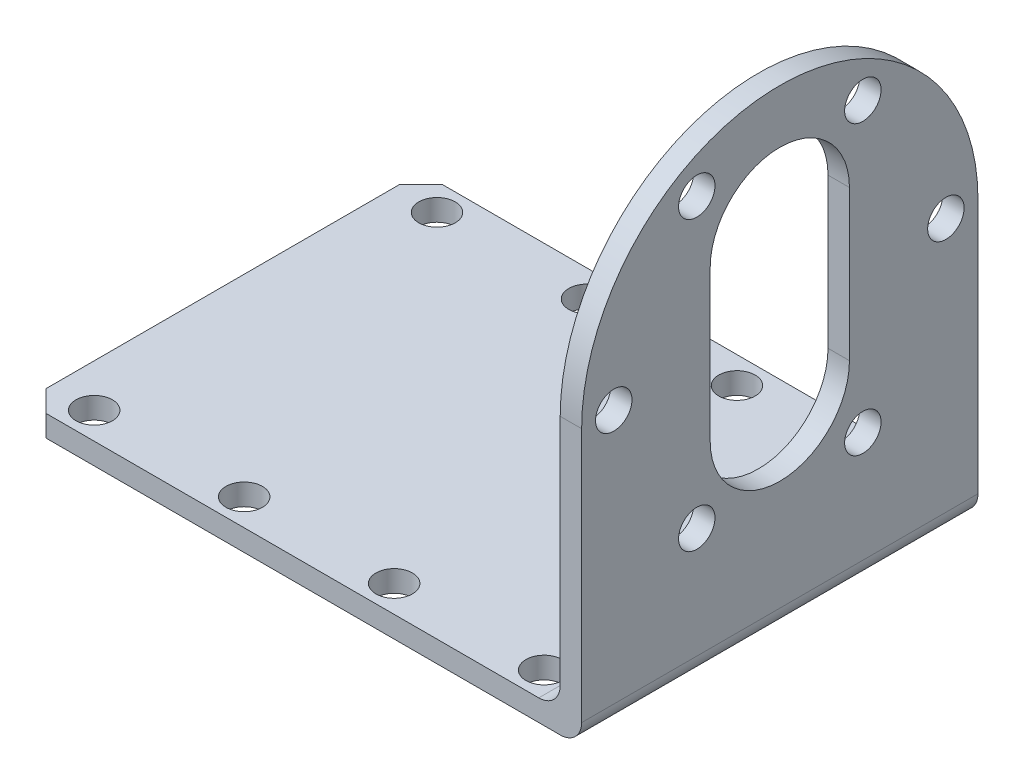
ISO-10303-21;
HEADER;
FILE_DESCRIPTION(('STEP AP214'),'2;1');
FILE_NAME('part.step','',(''),(''),'','','');
FILE_SCHEMA(('AUTOMOTIVE_DESIGN { 1 0 10303 214 1 1 1 1 }'));
ENDSEC;
DATA;
#1=APPLICATION_CONTEXT('core data for automotive mechanical design processes');
#2=APPLICATION_PROTOCOL_DEFINITION('international standard','automotive_design',2000,#1);
#3=PRODUCT_CONTEXT('',#1,'mechanical');
#4=PRODUCT('Part','Part','',(#3));
#5=PRODUCT_RELATED_PRODUCT_CATEGORY('part','',(#4));
#6=PRODUCT_DEFINITION_FORMATION('','',#4);
#7=PRODUCT_DEFINITION_CONTEXT('part definition',#1,'design');
#8=PRODUCT_DEFINITION('design','',#6,#7);
#9=PRODUCT_DEFINITION_SHAPE('','',#8);
#10=(LENGTH_UNIT() NAMED_UNIT(*) SI_UNIT(.MILLI.,.METRE.));
#11=(NAMED_UNIT(*) PLANE_ANGLE_UNIT() SI_UNIT($,.RADIAN.));
#12=(NAMED_UNIT(*) SI_UNIT($,.STERADIAN.) SOLID_ANGLE_UNIT());
#13=UNCERTAINTY_MEASURE_WITH_UNIT(LENGTH_MEASURE(1.E-05),#10,'distance_accuracy_value','');
#14=(GEOMETRIC_REPRESENTATION_CONTEXT(3) GLOBAL_UNCERTAINTY_ASSIGNED_CONTEXT((#13)) GLOBAL_UNIT_ASSIGNED_CONTEXT((#10,
#11,#12)) REPRESENTATION_CONTEXT('',''));
#15=CARTESIAN_POINT('',(0.,0.,0.));
#16=DIRECTION('',(0.,0.,1.));
#17=DIRECTION('',(1.,0.,0.));
#18=AXIS2_PLACEMENT_3D('',#15,#16,#17);
#19=CARTESIAN_POINT('',(26.,25.76,0.));
#20=DIRECTION('',(1.,0.,0.));
#21=DIRECTION('',(0.,0.,-1.));
#22=AXIS2_PLACEMENT_3D('',#19,#20,#21);
#23=CYLINDRICAL_SURFACE('',#22,18.5);
#24=DIRECTION('',(1.,0.,0.));
#25=VECTOR('',#24,1.);
#26=CARTESIAN_POINT('',(-26.,25.76,18.5));
#27=LINE('',#26,#25);
#28=CARTESIAN_POINT('',(26.,25.76,18.5));
#29=VERTEX_POINT('',#28);
#30=CARTESIAN_POINT('',(24.,25.76,18.5));
#31=VERTEX_POINT('',#30);
#32=EDGE_CURVE('E311',#29,#31,#27,.F.);
#33=ORIENTED_EDGE('',*,*,#32,.F.);
#34=CARTESIAN_POINT('',(26.,25.76,0.));
#35=DIRECTION('',(-1.,0.,0.));
#36=DIRECTION('',(0.,0.,1.));
#37=AXIS2_PLACEMENT_3D('',#34,#35,#36);
#38=CIRCLE('',#37,18.5);
#39=CARTESIAN_POINT('',(26.,25.76,-18.5));
#40=VERTEX_POINT('',#39);
#41=EDGE_CURVE('E317',#40,#29,#38,.F.);
#42=ORIENTED_EDGE('',*,*,#41,.F.);
#43=DIRECTION('',(1.,0.,0.));
#44=VECTOR('',#43,1.);
#45=CARTESIAN_POINT('',(-26.,25.76,-18.5));
#46=LINE('',#45,#44);
#47=CARTESIAN_POINT('',(24.,25.76,-18.5));
#48=VERTEX_POINT('',#47);
#49=EDGE_CURVE('E314',#48,#40,#46,.T.);
#50=ORIENTED_EDGE('',*,*,#49,.F.);
#51=CARTESIAN_POINT('',(24.,25.76,0.));
#52=DIRECTION('',(1.,0.,0.));
#53=DIRECTION('',(0.,0.,-1.));
#54=AXIS2_PLACEMENT_3D('',#51,#52,#53);
#55=CIRCLE('',#54,18.5);
#56=EDGE_CURVE('E319',#31,#48,#55,.F.);
#57=ORIENTED_EDGE('',*,*,#56,.F.);
#58=EDGE_LOOP('',(#33,#42,#50,#57));
#59=FACE_BOUND('',#58,.T.);
#60=ADVANCED_FACE('F38',(#59),#23,.T.);
#61=CARTESIAN_POINT('',(26.,2.,-18.5));
#62=DIRECTION('',(-1.,0.,0.));
#63=DIRECTION('',(0.,0.,1.));
#64=AXIS2_PLACEMENT_3D('',#61,#62,#63);
#65=PLANE('',#64);
#66=DIRECTION('',(0.,-1.,0.));
#67=VECTOR('',#66,1.);
#68=CARTESIAN_POINT('',(26.,18.76,-6.50000000000001));
#69=LINE('',#68,#67);
#70=CARTESIAN_POINT('',(26.,32.76,-6.50000000000001));
#71=VERTEX_POINT('',#70);
#72=CARTESIAN_POINT('',(26.,18.76,-6.50000000000001));
#73=VERTEX_POINT('',#72);
#74=EDGE_CURVE('E150',#71,#73,#69,.T.);
#75=ORIENTED_EDGE('',*,*,#74,.T.);
#76=CARTESIAN_POINT('',(26.,18.76,0.));
#77=DIRECTION('',(-1.,0.,0.));
#78=DIRECTION('',(0.,0.,1.));
#79=AXIS2_PLACEMENT_3D('',#76,#77,#78);
#80=CIRCLE('',#79,6.5);
#81=CARTESIAN_POINT('',(26.,18.76,6.5));
#82=VERTEX_POINT('',#81);
#83=EDGE_CURVE('E142',#73,#82,#80,.T.);
#84=ORIENTED_EDGE('',*,*,#83,.T.);
#85=DIRECTION('',(0.,1.,0.));
#86=VECTOR('',#85,1.);
#87=CARTESIAN_POINT('',(26.,18.76,6.5));
#88=LINE('',#87,#86);
#89=CARTESIAN_POINT('',(26.,32.76,6.5));
#90=VERTEX_POINT('',#89);
#91=EDGE_CURVE('E154',#82,#90,#88,.T.);
#92=ORIENTED_EDGE('',*,*,#91,.T.);
#93=CARTESIAN_POINT('',(26.,32.76,0.));
#94=DIRECTION('',(-1.,0.,0.));
#95=DIRECTION('',(0.,0.,1.));
#96=AXIS2_PLACEMENT_3D('',#93,#94,#95);
#97=CIRCLE('',#96,6.5);
#98=EDGE_CURVE('E158',#90,#71,#97,.T.);
#99=ORIENTED_EDGE('',*,*,#98,.T.);
#100=EDGE_LOOP('',(#75,#84,#92,#99));
#101=FACE_BOUND('',#100,.T.);
#102=CARTESIAN_POINT('',(26.,25.76,-15.5));
#103=DIRECTION('',(-1.,0.,0.));
#104=DIRECTION('',(0.,0.,1.));
#105=AXIS2_PLACEMENT_3D('',#102,#103,#104);
#106=CIRCLE('',#105,1.7);
#107=CARTESIAN_POINT('',(26.,25.76,-13.8));
#108=VERTEX_POINT('',#107);
#109=EDGE_CURVE('E184',#108,#108,#106,.T.);
#110=ORIENTED_EDGE('',*,*,#109,.T.);
#111=EDGE_LOOP('',(#110));
#112=FACE_BOUND('',#111,.T.);
#113=CARTESIAN_POINT('',(26.,39.1833937586588,-7.74999999999997));
#114=DIRECTION('',(-1.,0.,0.));
#115=DIRECTION('',(0.,0.,1.));
#116=AXIS2_PLACEMENT_3D('',#113,#114,#115);
#117=CIRCLE('',#116,1.7);
#118=CARTESIAN_POINT('',(26.,39.1833937586588,-6.04999999999997));
#119=VERTEX_POINT('',#118);
#120=EDGE_CURVE('E190',#119,#119,#117,.T.);
#121=ORIENTED_EDGE('',*,*,#120,.T.);
#122=EDGE_LOOP('',(#121));
#123=FACE_BOUND('',#122,.T.);
#124=CARTESIAN_POINT('',(26.,39.1833937586588,7.75000000000006));
#125=DIRECTION('',(-1.,0.,0.));
#126=DIRECTION('',(0.,0.,1.));
#127=AXIS2_PLACEMENT_3D('',#124,#125,#126);
#128=CIRCLE('',#127,1.7);
#129=CARTESIAN_POINT('',(26.,39.1833937586588,9.45000000000006));
#130=VERTEX_POINT('',#129);
#131=EDGE_CURVE('E196',#130,#130,#128,.T.);
#132=ORIENTED_EDGE('',*,*,#131,.T.);
#133=EDGE_LOOP('',(#132));
#134=FACE_BOUND('',#133,.T.);
#135=CARTESIAN_POINT('',(26.,25.7599999999999,15.5));
#136=DIRECTION('',(-1.,0.,0.));
#137=DIRECTION('',(0.,0.,1.));
#138=AXIS2_PLACEMENT_3D('',#135,#136,#137);
#139=CIRCLE('',#138,1.7);
#140=CARTESIAN_POINT('',(26.,25.7599999999999,17.2));
#141=VERTEX_POINT('',#140);
#142=EDGE_CURVE('E202',#141,#141,#139,.T.);
#143=ORIENTED_EDGE('',*,*,#142,.T.);
#144=EDGE_LOOP('',(#143));
#145=FACE_BOUND('',#144,.T.);
#146=CARTESIAN_POINT('',(26.,12.3366062413411,7.74999999999987));
#147=DIRECTION('',(-1.,0.,0.));
#148=DIRECTION('',(0.,0.,1.));
#149=AXIS2_PLACEMENT_3D('',#146,#147,#148);
#150=CIRCLE('',#149,1.7);
#151=CARTESIAN_POINT('',(26.,12.3366062413411,9.44999999999987));
#152=VERTEX_POINT('',#151);
#153=EDGE_CURVE('E208',#152,#152,#150,.T.);
#154=ORIENTED_EDGE('',*,*,#153,.T.);
#155=EDGE_LOOP('',(#154));
#156=FACE_BOUND('',#155,.T.);
#157=CARTESIAN_POINT('',(26.,12.3366062413413,-7.75000000000016));
#158=DIRECTION('',(-1.,0.,0.));
#159=DIRECTION('',(0.,0.,1.));
#160=AXIS2_PLACEMENT_3D('',#157,#158,#159);
#161=CIRCLE('',#160,1.7);
#162=CARTESIAN_POINT('',(26.,12.3366062413413,-6.05000000000016));
#163=VERTEX_POINT('',#162);
#164=EDGE_CURVE('E214',#163,#163,#161,.T.);
#165=ORIENTED_EDGE('',*,*,#164,.T.);
#166=EDGE_LOOP('',(#165));
#167=FACE_BOUND('',#166,.T.);
#168=DIRECTION('',(0.,-1.,0.));
#169=VECTOR('',#168,1.);
#170=CARTESIAN_POINT('',(26.,2.,18.5));
#171=LINE('',#170,#169);
#172=CARTESIAN_POINT('',(26.,2.,18.5));
#173=VERTEX_POINT('',#172);
#174=EDGE_CURVE('E279',#29,#173,#171,.T.);
#175=ORIENTED_EDGE('',*,*,#174,.T.);
#176=DIRECTION('',(0.,0.,-1.));
#177=VECTOR('',#176,1.);
#178=CARTESIAN_POINT('',(26.,2.,-18.5));
#179=LINE('',#178,#177);
#180=CARTESIAN_POINT('',(26.,2.,-18.5));
#181=VERTEX_POINT('',#180);
#182=EDGE_CURVE('E321',#173,#181,#179,.T.);
#183=ORIENTED_EDGE('',*,*,#182,.T.);
#184=DIRECTION('',(0.,-1.,0.));
#185=VECTOR('',#184,1.);
#186=CARTESIAN_POINT('',(26.,2.,-18.5));
#187=LINE('',#186,#185);
#188=EDGE_CURVE('E288',#40,#181,#187,.T.);
#189=ORIENTED_EDGE('',*,*,#188,.F.);
#190=ORIENTED_EDGE('',*,*,#41,.T.);
#191=EDGE_LOOP('',(#175,#183,#189,#190));
#192=FACE_BOUND('',#191,.T.);
#193=ADVANCED_FACE('F160',(#101,#112,#123,#134,#145,#156,#167,#192),#65,.F.);
#194=CARTESIAN_POINT('',(-26.,2.,-18.5));
#195=DIRECTION('',(0.,0.,1.));
#196=DIRECTION('',(1.,0.,0.));
#197=AXIS2_PLACEMENT_3D('',#194,#195,#196);
#198=PLANE('',#197);
#199=ORIENTED_EDGE('',*,*,#188,.T.);
#200=CARTESIAN_POINT('',(24.,2.,-18.5));
#201=DIRECTION('',(0.,0.,1.));
#202=DIRECTION('',(1.,0.,0.));
#203=AXIS2_PLACEMENT_3D('',#200,#201,#202);
#204=CIRCLE('',#203,2.);
#205=CARTESIAN_POINT('',(24.,0.,-18.5));
#206=VERTEX_POINT('',#205);
#207=EDGE_CURVE('E324',#181,#206,#204,.F.);
#208=ORIENTED_EDGE('',*,*,#207,.T.);
#209=DIRECTION('',(-1.,0.,0.));
#210=VECTOR('',#209,1.);
#211=CARTESIAN_POINT('',(-26.,0.,-18.5));
#212=LINE('',#211,#210);
#213=CARTESIAN_POINT('',(-24.,0.,-18.5));
#214=VERTEX_POINT('',#213);
#215=EDGE_CURVE('E270',#206,#214,#212,.T.);
#216=ORIENTED_EDGE('',*,*,#215,.T.);
#217=DIRECTION('',(0.,1.,0.));
#218=VECTOR('',#217,1.);
#219=CARTESIAN_POINT('',(-24.,2.,-18.5));
#220=LINE('',#219,#218);
#221=CARTESIAN_POINT('',(-24.,2.,-18.5));
#222=VERTEX_POINT('',#221);
#223=EDGE_CURVE('E308',#214,#222,#220,.T.);
#224=ORIENTED_EDGE('',*,*,#223,.T.);
#225=DIRECTION('',(-1.,0.,0.));
#226=VECTOR('',#225,1.);
#227=CARTESIAN_POINT('',(-26.,2.,-18.5));
#228=LINE('',#227,#226);
#229=CARTESIAN_POINT('',(22.,2.,-18.5));
#230=VERTEX_POINT('',#229);
#231=EDGE_CURVE('E271',#230,#222,#228,.T.);
#232=ORIENTED_EDGE('',*,*,#231,.F.);
#233=CARTESIAN_POINT('',(22.,4.,-18.5));
#234=DIRECTION('',(0.,0.,1.));
#235=DIRECTION('',(1.,0.,0.));
#236=AXIS2_PLACEMENT_3D('',#233,#234,#235);
#237=CIRCLE('',#236,2.);
#238=CARTESIAN_POINT('',(24.,4.,-18.5));
#239=VERTEX_POINT('',#238);
#240=EDGE_CURVE('E11',#230,#239,#237,.T.);
#241=ORIENTED_EDGE('',*,*,#240,.T.);
#242=DIRECTION('',(0.,-1.,0.));
#243=VECTOR('',#242,1.);
#244=CARTESIAN_POINT('',(24.,44.26,-18.5));
#245=LINE('',#244,#243);
#246=EDGE_CURVE('E219',#48,#239,#245,.T.);
#247=ORIENTED_EDGE('',*,*,#246,.F.);
#248=ORIENTED_EDGE('',*,*,#49,.T.);
#249=EDGE_LOOP('',(#199,#208,#216,#224,#232,#241,#247,#248));
#250=FACE_BOUND('',#249,.T.);
#251=ADVANCED_FACE('F347',(#250),#198,.F.);
#252=CARTESIAN_POINT('',(-26.,2.,-18.5));
#253=DIRECTION('',(1.,0.,0.));
#254=DIRECTION('',(0.,0.,-1.));
#255=AXIS2_PLACEMENT_3D('',#252,#253,#254);
#256=PLANE('',#255);
#257=DIRECTION('',(0.,0.,1.));
#258=VECTOR('',#257,1.);
#259=CARTESIAN_POINT('',(-26.,0.,-18.5));
#260=LINE('',#259,#258);
#261=CARTESIAN_POINT('',(-26.,0.,-16.5));
#262=VERTEX_POINT('',#261);
#263=CARTESIAN_POINT('',(-26.,0.,16.5));
#264=VERTEX_POINT('',#263);
#265=EDGE_CURVE('E281',#262,#264,#260,.T.);
#266=ORIENTED_EDGE('',*,*,#265,.T.);
#267=DIRECTION('',(0.,1.,0.));
#268=VECTOR('',#267,1.);
#269=CARTESIAN_POINT('',(-26.,2.,16.5));
#270=LINE('',#269,#268);
#271=CARTESIAN_POINT('',(-26.,2.,16.5));
#272=VERTEX_POINT('',#271);
#273=EDGE_CURVE('E302',#264,#272,#270,.T.);
#274=ORIENTED_EDGE('',*,*,#273,.T.);
#275=DIRECTION('',(0.,0.,1.));
#276=VECTOR('',#275,1.);
#277=CARTESIAN_POINT('',(-26.,2.,-18.5));
#278=LINE('',#277,#276);
#279=CARTESIAN_POINT('',(-26.,2.,-16.5));
#280=VERTEX_POINT('',#279);
#281=EDGE_CURVE('E273',#280,#272,#278,.T.);
#282=ORIENTED_EDGE('',*,*,#281,.F.);
#283=DIRECTION('',(0.,-1.,0.));
#284=VECTOR('',#283,1.);
#285=CARTESIAN_POINT('',(-26.,2.,-16.5));
#286=LINE('',#285,#284);
#287=EDGE_CURVE('E299',#280,#262,#286,.T.);
#288=ORIENTED_EDGE('',*,*,#287,.T.);
#289=EDGE_LOOP('',(#266,#274,#282,#288));
#290=FACE_BOUND('',#289,.T.);
#291=ADVANCED_FACE('F381',(#290),#256,.F.);
#292=CARTESIAN_POINT('',(-26.,2.,18.5));
#293=DIRECTION('',(0.,0.,-1.));
#294=DIRECTION('',(-1.,0.,0.));
#295=AXIS2_PLACEMENT_3D('',#292,#293,#294);
#296=PLANE('',#295);
#297=DIRECTION('',(1.,0.,0.));
#298=VECTOR('',#297,1.);
#299=CARTESIAN_POINT('',(-26.,0.,18.5));
#300=LINE('',#299,#298);
#301=CARTESIAN_POINT('',(-24.,0.,18.5));
#302=VERTEX_POINT('',#301);
#303=CARTESIAN_POINT('',(24.,0.,18.5));
#304=VERTEX_POINT('',#303);
#305=EDGE_CURVE('E274',#302,#304,#300,.T.);
#306=ORIENTED_EDGE('',*,*,#305,.T.);
#307=CARTESIAN_POINT('',(24.,2.,18.5));
#308=DIRECTION('',(0.,0.,-1.));
#309=DIRECTION('',(-1.,0.,0.));
#310=AXIS2_PLACEMENT_3D('',#307,#308,#309);
#311=CIRCLE('',#310,2.);
#312=EDGE_CURVE('E328',#304,#173,#311,.F.);
#313=ORIENTED_EDGE('',*,*,#312,.T.);
#314=ORIENTED_EDGE('',*,*,#174,.F.);
#315=ORIENTED_EDGE('',*,*,#32,.T.);
#316=DIRECTION('',(0.,-1.,0.));
#317=VECTOR('',#316,1.);
#318=CARTESIAN_POINT('',(24.,44.26,18.5));
#319=LINE('',#318,#317);
#320=CARTESIAN_POINT('',(24.,4.,18.5));
#321=VERTEX_POINT('',#320);
#322=EDGE_CURVE('E217',#31,#321,#319,.T.);
#323=ORIENTED_EDGE('',*,*,#322,.T.);
#324=CARTESIAN_POINT('',(22.,4.,18.5));
#325=DIRECTION('',(0.,0.,-1.));
#326=DIRECTION('',(-1.,0.,0.));
#327=AXIS2_PLACEMENT_3D('',#324,#325,#326);
#328=CIRCLE('',#327,2.);
#329=CARTESIAN_POINT('',(22.,2.,18.5));
#330=VERTEX_POINT('',#329);
#331=EDGE_CURVE('E46',#321,#330,#328,.T.);
#332=ORIENTED_EDGE('',*,*,#331,.T.);
#333=DIRECTION('',(1.,0.,0.));
#334=VECTOR('',#333,1.);
#335=CARTESIAN_POINT('',(-26.,2.,18.5));
#336=LINE('',#335,#334);
#337=CARTESIAN_POINT('',(-24.,2.,18.5));
#338=VERTEX_POINT('',#337);
#339=EDGE_CURVE('E277',#338,#330,#336,.T.);
#340=ORIENTED_EDGE('',*,*,#339,.F.);
#341=DIRECTION('',(0.,-1.,0.));
#342=VECTOR('',#341,1.);
#343=CARTESIAN_POINT('',(-24.,2.,18.5));
#344=LINE('',#343,#342);
#345=EDGE_CURVE('E291',#338,#302,#344,.T.);
#346=ORIENTED_EDGE('',*,*,#345,.T.);
#347=EDGE_LOOP('',(#306,#313,#314,#315,#323,#332,#340,#346));
#348=FACE_BOUND('',#347,.T.);
#349=ADVANCED_FACE('F340',(#348),#296,.F.);
#350=CARTESIAN_POINT('',(0.,2.,0.));
#351=DIRECTION('',(0.,1.,0.));
#352=DIRECTION('',(0.,0.,1.));
#353=AXIS2_PLACEMENT_3D('',#350,#351,#352);
#354=PLANE('',#353);
#355=ORIENTED_EDGE('',*,*,#339,.T.);
#356=DIRECTION('',(0.,0.,1.));
#357=VECTOR('',#356,1.);
#358=CARTESIAN_POINT('',(22.,2.,0.));
#359=LINE('',#358,#357);
#360=EDGE_CURVE('E53',#330,#230,#359,.F.);
#361=ORIENTED_EDGE('',*,*,#360,.T.);
#362=ORIENTED_EDGE('',*,*,#231,.T.);
#363=DIRECTION('',(0.70710678118655,0.,-0.707106781186545));
#364=VECTOR('',#363,1.);
#365=CARTESIAN_POINT('',(-21.2499999999999,2.,-21.2500000000001));
#366=LINE('',#365,#364);
#367=EDGE_CURVE('E304',#222,#280,#366,.F.);
#368=ORIENTED_EDGE('',*,*,#367,.T.);
#369=ORIENTED_EDGE('',*,*,#281,.T.);
#370=DIRECTION('',(-0.707106781186545,0.,-0.70710678118655));
#371=VECTOR('',#370,1.);
#372=CARTESIAN_POINT('',(-21.2500000000001,2.,21.2499999999999));
#373=LINE('',#372,#371);
#374=EDGE_CURVE('E306',#272,#338,#373,.F.);
#375=ORIENTED_EDGE('',*,*,#374,.T.);
#376=EDGE_LOOP('',(#355,#361,#362,#368,#369,#375));
#377=FACE_BOUND('',#376,.T.);
#378=CARTESIAN_POINT('',(-22.,2.,-16.));
#379=DIRECTION('',(0.,1.,0.));
#380=DIRECTION('',(0.,0.,1.));
#381=AXIS2_PLACEMENT_3D('',#378,#379,#380);
#382=CIRCLE('',#381,1.69999999999999);
#383=CARTESIAN_POINT('',(-22.,2.,-14.3));
#384=VERTEX_POINT('',#383);
#385=EDGE_CURVE('E222',#384,#384,#382,.T.);
#386=ORIENTED_EDGE('',*,*,#385,.F.);
#387=EDGE_LOOP('',(#386));
#388=FACE_BOUND('',#387,.T.);
#389=CARTESIAN_POINT('',(-8.00000000000002,2.,-16.));
#390=DIRECTION('',(0.,1.,0.));
#391=DIRECTION('',(0.,0.,1.));
#392=AXIS2_PLACEMENT_3D('',#389,#390,#391);
#393=CIRCLE('',#392,1.69999999999999);
#394=CARTESIAN_POINT('',(-8.00000000000002,2.,-14.3));
#395=VERTEX_POINT('',#394);
#396=EDGE_CURVE('E228',#395,#395,#393,.T.);
#397=ORIENTED_EDGE('',*,*,#396,.F.);
#398=EDGE_LOOP('',(#397));
#399=FACE_BOUND('',#398,.T.);
#400=CARTESIAN_POINT('',(5.99999999999998,2.,-16.));
#401=DIRECTION('',(0.,1.,0.));
#402=DIRECTION('',(0.,0.,1.));
#403=AXIS2_PLACEMENT_3D('',#400,#401,#402);
#404=CIRCLE('',#403,1.69999999999999);
#405=CARTESIAN_POINT('',(5.99999999999998,2.,-14.3));
#406=VERTEX_POINT('',#405);
#407=EDGE_CURVE('E234',#406,#406,#404,.T.);
#408=ORIENTED_EDGE('',*,*,#407,.F.);
#409=EDGE_LOOP('',(#408));
#410=FACE_BOUND('',#409,.T.);
#411=CARTESIAN_POINT('',(20.,2.,-16.));
#412=DIRECTION('',(0.,1.,0.));
#413=DIRECTION('',(0.,0.,1.));
#414=AXIS2_PLACEMENT_3D('',#411,#412,#413);
#415=CIRCLE('',#414,1.69999999999999);
#416=CARTESIAN_POINT('',(20.,2.,-14.3));
#417=VERTEX_POINT('',#416);
#418=EDGE_CURVE('E240',#417,#417,#415,.T.);
#419=ORIENTED_EDGE('',*,*,#418,.F.);
#420=EDGE_LOOP('',(#419));
#421=FACE_BOUND('',#420,.T.);
#422=CARTESIAN_POINT('',(-22.,2.,16.));
#423=DIRECTION('',(0.,1.,0.));
#424=DIRECTION('',(0.,0.,1.));
#425=AXIS2_PLACEMENT_3D('',#422,#423,#424);
#426=CIRCLE('',#425,1.69999999999999);
#427=CARTESIAN_POINT('',(-22.,2.,17.7));
#428=VERTEX_POINT('',#427);
#429=EDGE_CURVE('E246',#428,#428,#426,.T.);
#430=ORIENTED_EDGE('',*,*,#429,.F.);
#431=EDGE_LOOP('',(#430));
#432=FACE_BOUND('',#431,.T.);
#433=CARTESIAN_POINT('',(-8.00000000000002,2.,16.));
#434=DIRECTION('',(0.,1.,0.));
#435=DIRECTION('',(0.,0.,1.));
#436=AXIS2_PLACEMENT_3D('',#433,#434,#435);
#437=CIRCLE('',#436,1.69999999999999);
#438=CARTESIAN_POINT('',(-8.00000000000002,2.,17.7));
#439=VERTEX_POINT('',#438);
#440=EDGE_CURVE('E252',#439,#439,#437,.T.);
#441=ORIENTED_EDGE('',*,*,#440,.F.);
#442=EDGE_LOOP('',(#441));
#443=FACE_BOUND('',#442,.T.);
#444=CARTESIAN_POINT('',(5.99999999999998,2.,16.));
#445=DIRECTION('',(0.,1.,0.));
#446=DIRECTION('',(0.,0.,1.));
#447=AXIS2_PLACEMENT_3D('',#444,#445,#446);
#448=CIRCLE('',#447,1.69999999999999);
#449=CARTESIAN_POINT('',(5.99999999999998,2.,17.7));
#450=VERTEX_POINT('',#449);
#451=EDGE_CURVE('E258',#450,#450,#448,.T.);
#452=ORIENTED_EDGE('',*,*,#451,.F.);
#453=EDGE_LOOP('',(#452));
#454=FACE_BOUND('',#453,.T.);
#455=CARTESIAN_POINT('',(20.,2.,16.));
#456=DIRECTION('',(0.,1.,0.));
#457=DIRECTION('',(0.,0.,1.));
#458=AXIS2_PLACEMENT_3D('',#455,#456,#457);
#459=CIRCLE('',#458,1.69999999999999);
#460=CARTESIAN_POINT('',(20.,2.,17.7));
#461=VERTEX_POINT('',#460);
#462=EDGE_CURVE('E264',#461,#461,#459,.T.);
#463=ORIENTED_EDGE('',*,*,#462,.F.);
#464=EDGE_LOOP('',(#463));
#465=FACE_BOUND('',#464,.T.);
#466=ADVANCED_FACE('F387',(#377,#388,#399,#410,#421,#432,#443,#454,#465),#354,.T.);
#467=CARTESIAN_POINT('',(0.,0.,0.));
#468=DIRECTION('',(0.,1.,0.));
#469=DIRECTION('',(0.,0.,1.));
#470=AXIS2_PLACEMENT_3D('',#467,#468,#469);
#471=PLANE('',#470);
#472=CARTESIAN_POINT('',(-22.,0.,-16.));
#473=DIRECTION('',(0.,1.,0.));
#474=DIRECTION('',(0.,0.,1.));
#475=AXIS2_PLACEMENT_3D('',#472,#473,#474);
#476=CIRCLE('',#475,1.7);
#477=CARTESIAN_POINT('',(-22.,0.,-14.3));
#478=VERTEX_POINT('',#477);
#479=EDGE_CURVE('E225',#478,#478,#476,.T.);
#480=ORIENTED_EDGE('',*,*,#479,.T.);
#481=EDGE_LOOP('',(#480));
#482=FACE_BOUND('',#481,.T.);
#483=CARTESIAN_POINT('',(-8.00000000000002,0.,-16.));
#484=DIRECTION('',(0.,1.,0.));
#485=DIRECTION('',(0.,0.,1.));
#486=AXIS2_PLACEMENT_3D('',#483,#484,#485);
#487=CIRCLE('',#486,1.7);
#488=CARTESIAN_POINT('',(-8.00000000000002,0.,-14.3));
#489=VERTEX_POINT('',#488);
#490=EDGE_CURVE('E231',#489,#489,#487,.T.);
#491=ORIENTED_EDGE('',*,*,#490,.T.);
#492=EDGE_LOOP('',(#491));
#493=FACE_BOUND('',#492,.T.);
#494=CARTESIAN_POINT('',(5.99999999999998,0.,-16.));
#495=DIRECTION('',(0.,1.,0.));
#496=DIRECTION('',(0.,0.,1.));
#497=AXIS2_PLACEMENT_3D('',#494,#495,#496);
#498=CIRCLE('',#497,1.7);
#499=CARTESIAN_POINT('',(5.99999999999998,0.,-14.3));
#500=VERTEX_POINT('',#499);
#501=EDGE_CURVE('E237',#500,#500,#498,.T.);
#502=ORIENTED_EDGE('',*,*,#501,.T.);
#503=EDGE_LOOP('',(#502));
#504=FACE_BOUND('',#503,.T.);
#505=CARTESIAN_POINT('',(20.,0.,-16.));
#506=DIRECTION('',(0.,1.,0.));
#507=DIRECTION('',(0.,0.,1.));
#508=AXIS2_PLACEMENT_3D('',#505,#506,#507);
#509=CIRCLE('',#508,1.7);
#510=CARTESIAN_POINT('',(20.,0.,-14.3));
#511=VERTEX_POINT('',#510);
#512=EDGE_CURVE('E243',#511,#511,#509,.T.);
#513=ORIENTED_EDGE('',*,*,#512,.T.);
#514=EDGE_LOOP('',(#513));
#515=FACE_BOUND('',#514,.T.);
#516=CARTESIAN_POINT('',(-22.,0.,16.));
#517=DIRECTION('',(0.,1.,0.));
#518=DIRECTION('',(0.,0.,1.));
#519=AXIS2_PLACEMENT_3D('',#516,#517,#518);
#520=CIRCLE('',#519,1.7);
#521=CARTESIAN_POINT('',(-22.,0.,17.7));
#522=VERTEX_POINT('',#521);
#523=EDGE_CURVE('E249',#522,#522,#520,.T.);
#524=ORIENTED_EDGE('',*,*,#523,.T.);
#525=EDGE_LOOP('',(#524));
#526=FACE_BOUND('',#525,.T.);
#527=CARTESIAN_POINT('',(-8.00000000000002,0.,16.));
#528=DIRECTION('',(0.,1.,0.));
#529=DIRECTION('',(0.,0.,1.));
#530=AXIS2_PLACEMENT_3D('',#527,#528,#529);
#531=CIRCLE('',#530,1.7);
#532=CARTESIAN_POINT('',(-8.00000000000002,0.,17.7));
#533=VERTEX_POINT('',#532);
#534=EDGE_CURVE('E255',#533,#533,#531,.T.);
#535=ORIENTED_EDGE('',*,*,#534,.T.);
#536=EDGE_LOOP('',(#535));
#537=FACE_BOUND('',#536,.T.);
#538=CARTESIAN_POINT('',(5.99999999999998,0.,16.));
#539=DIRECTION('',(0.,1.,0.));
#540=DIRECTION('',(0.,0.,1.));
#541=AXIS2_PLACEMENT_3D('',#538,#539,#540);
#542=CIRCLE('',#541,1.7);
#543=CARTESIAN_POINT('',(5.99999999999998,0.,17.7));
#544=VERTEX_POINT('',#543);
#545=EDGE_CURVE('E261',#544,#544,#542,.T.);
#546=ORIENTED_EDGE('',*,*,#545,.T.);
#547=EDGE_LOOP('',(#546));
#548=FACE_BOUND('',#547,.T.);
#549=CARTESIAN_POINT('',(20.,0.,16.));
#550=DIRECTION('',(0.,1.,0.));
#551=DIRECTION('',(0.,0.,1.));
#552=AXIS2_PLACEMENT_3D('',#549,#550,#551);
#553=CIRCLE('',#552,1.7);
#554=CARTESIAN_POINT('',(20.,0.,17.7));
#555=VERTEX_POINT('',#554);
#556=EDGE_CURVE('E267',#555,#555,#553,.T.);
#557=ORIENTED_EDGE('',*,*,#556,.T.);
#558=EDGE_LOOP('',(#557));
#559=FACE_BOUND('',#558,.T.);
#560=ORIENTED_EDGE('',*,*,#215,.F.);
#561=DIRECTION('',(0.,0.,-1.));
#562=VECTOR('',#561,1.);
#563=CARTESIAN_POINT('',(24.,0.,0.));
#564=LINE('',#563,#562);
#565=EDGE_CURVE('E326',#206,#304,#564,.F.);
#566=ORIENTED_EDGE('',*,*,#565,.T.);
#567=ORIENTED_EDGE('',*,*,#305,.F.);
#568=DIRECTION('',(0.707106781186545,0.,0.70710678118655));
#569=VECTOR('',#568,1.);
#570=CARTESIAN_POINT('',(-24.,0.,18.5));
#571=LINE('',#570,#569);
#572=EDGE_CURVE('E297',#302,#264,#571,.F.);
#573=ORIENTED_EDGE('',*,*,#572,.T.);
#574=ORIENTED_EDGE('',*,*,#265,.F.);
#575=DIRECTION('',(-0.70710678118655,0.,0.707106781186545));
#576=VECTOR('',#575,1.);
#577=CARTESIAN_POINT('',(-26.,0.,-16.5));
#578=LINE('',#577,#576);
#579=EDGE_CURVE('E294',#262,#214,#578,.F.);
#580=ORIENTED_EDGE('',*,*,#579,.T.);
#581=EDGE_LOOP('',(#560,#566,#567,#573,#574,#580));
#582=FACE_BOUND('',#581,.T.);
#583=ADVANCED_FACE('F388',(#482,#493,#504,#515,#526,#537,#548,#559,#582),#471,.F.);
#584=CARTESIAN_POINT('',(20.,2.,16.));
#585=DIRECTION('',(0.,1.,0.));
#586=DIRECTION('',(0.,0.,1.));
#587=AXIS2_PLACEMENT_3D('',#584,#585,#586);
#588=CYLINDRICAL_SURFACE('',#587,1.69999999999999);
#589=ORIENTED_EDGE('',*,*,#556,.F.);
#590=EDGE_LOOP('',(#589));
#591=FACE_BOUND('',#590,.T.);
#592=ORIENTED_EDGE('',*,*,#462,.T.);
#593=EDGE_LOOP('',(#592));
#594=FACE_BOUND('',#593,.T.);
#595=ADVANCED_FACE('F391',(#591,#594),#588,.F.);
#596=CARTESIAN_POINT('',(5.99999999999998,2.,16.));
#597=DIRECTION('',(0.,1.,0.));
#598=DIRECTION('',(0.,0.,1.));
#599=AXIS2_PLACEMENT_3D('',#596,#597,#598);
#600=CYLINDRICAL_SURFACE('',#599,1.69999999999999);
#601=ORIENTED_EDGE('',*,*,#545,.F.);
#602=EDGE_LOOP('',(#601));
#603=FACE_BOUND('',#602,.T.);
#604=ORIENTED_EDGE('',*,*,#451,.T.);
#605=EDGE_LOOP('',(#604));
#606=FACE_BOUND('',#605,.T.);
#607=ADVANCED_FACE('F397',(#603,#606),#600,.F.);
#608=CARTESIAN_POINT('',(-8.00000000000002,2.,16.));
#609=DIRECTION('',(0.,1.,0.));
#610=DIRECTION('',(0.,0.,1.));
#611=AXIS2_PLACEMENT_3D('',#608,#609,#610);
#612=CYLINDRICAL_SURFACE('',#611,1.69999999999999);
#613=ORIENTED_EDGE('',*,*,#534,.F.);
#614=EDGE_LOOP('',(#613));
#615=FACE_BOUND('',#614,.T.);
#616=ORIENTED_EDGE('',*,*,#440,.T.);
#617=EDGE_LOOP('',(#616));
#618=FACE_BOUND('',#617,.T.);
#619=ADVANCED_FACE('F401',(#615,#618),#612,.F.);
#620=CARTESIAN_POINT('',(-22.,2.,16.));
#621=DIRECTION('',(0.,1.,0.));
#622=DIRECTION('',(0.,0.,1.));
#623=AXIS2_PLACEMENT_3D('',#620,#621,#622);
#624=CYLINDRICAL_SURFACE('',#623,1.69999999999999);
#625=ORIENTED_EDGE('',*,*,#523,.F.);
#626=EDGE_LOOP('',(#625));
#627=FACE_BOUND('',#626,.T.);
#628=ORIENTED_EDGE('',*,*,#429,.T.);
#629=EDGE_LOOP('',(#628));
#630=FACE_BOUND('',#629,.T.);
#631=ADVANCED_FACE('F405',(#627,#630),#624,.F.);
#632=CARTESIAN_POINT('',(20.,2.,-16.));
#633=DIRECTION('',(0.,1.,0.));
#634=DIRECTION('',(0.,0.,1.));
#635=AXIS2_PLACEMENT_3D('',#632,#633,#634);
#636=CYLINDRICAL_SURFACE('',#635,1.69999999999999);
#637=ORIENTED_EDGE('',*,*,#512,.F.);
#638=EDGE_LOOP('',(#637));
#639=FACE_BOUND('',#638,.T.);
#640=ORIENTED_EDGE('',*,*,#418,.T.);
#641=EDGE_LOOP('',(#640));
#642=FACE_BOUND('',#641,.T.);
#643=ADVANCED_FACE('F409',(#639,#642),#636,.F.);
#644=CARTESIAN_POINT('',(5.99999999999998,2.,-16.));
#645=DIRECTION('',(0.,1.,0.));
#646=DIRECTION('',(0.,0.,1.));
#647=AXIS2_PLACEMENT_3D('',#644,#645,#646);
#648=CYLINDRICAL_SURFACE('',#647,1.69999999999999);
#649=ORIENTED_EDGE('',*,*,#501,.F.);
#650=EDGE_LOOP('',(#649));
#651=FACE_BOUND('',#650,.T.);
#652=ORIENTED_EDGE('',*,*,#407,.T.);
#653=EDGE_LOOP('',(#652));
#654=FACE_BOUND('',#653,.T.);
#655=ADVANCED_FACE('F413',(#651,#654),#648,.F.);
#656=CARTESIAN_POINT('',(-8.00000000000002,2.,-16.));
#657=DIRECTION('',(0.,1.,0.));
#658=DIRECTION('',(0.,0.,1.));
#659=AXIS2_PLACEMENT_3D('',#656,#657,#658);
#660=CYLINDRICAL_SURFACE('',#659,1.69999999999999);
#661=ORIENTED_EDGE('',*,*,#490,.F.);
#662=EDGE_LOOP('',(#661));
#663=FACE_BOUND('',#662,.T.);
#664=ORIENTED_EDGE('',*,*,#396,.T.);
#665=EDGE_LOOP('',(#664));
#666=FACE_BOUND('',#665,.T.);
#667=ADVANCED_FACE('F417',(#663,#666),#660,.F.);
#668=CARTESIAN_POINT('',(-22.,2.,-16.));
#669=DIRECTION('',(0.,1.,0.));
#670=DIRECTION('',(0.,0.,1.));
#671=AXIS2_PLACEMENT_3D('',#668,#669,#670);
#672=CYLINDRICAL_SURFACE('',#671,1.69999999999999);
#673=ORIENTED_EDGE('',*,*,#479,.F.);
#674=EDGE_LOOP('',(#673));
#675=FACE_BOUND('',#674,.T.);
#676=ORIENTED_EDGE('',*,*,#385,.T.);
#677=EDGE_LOOP('',(#676));
#678=FACE_BOUND('',#677,.T.);
#679=ADVANCED_FACE('F421',(#675,#678),#672,.F.);
#680=CARTESIAN_POINT('',(24.,44.26,-18.5));
#681=DIRECTION('',(1.,0.,0.));
#682=DIRECTION('',(0.,0.,-1.));
#683=AXIS2_PLACEMENT_3D('',#680,#681,#682);
#684=PLANE('',#683);
#685=DIRECTION('',(0.,1.,0.));
#686=VECTOR('',#685,1.);
#687=CARTESIAN_POINT('',(24.,18.76,6.5));
#688=LINE('',#687,#686);
#689=CARTESIAN_POINT('',(24.,18.76,6.5));
#690=VERTEX_POINT('',#689);
#691=CARTESIAN_POINT('',(24.,32.76,6.5));
#692=VERTEX_POINT('',#691);
#693=EDGE_CURVE('E172',#690,#692,#688,.T.);
#694=ORIENTED_EDGE('',*,*,#693,.F.);
#695=CARTESIAN_POINT('',(24.,18.76,0.));
#696=DIRECTION('',(-1.,0.,0.));
#697=DIRECTION('',(0.,0.,1.));
#698=AXIS2_PLACEMENT_3D('',#695,#696,#697);
#699=CIRCLE('',#698,6.5);
#700=CARTESIAN_POINT('',(24.,18.76,-6.50000000000001));
#701=VERTEX_POINT('',#700);
#702=EDGE_CURVE('E145',#701,#690,#699,.T.);
#703=ORIENTED_EDGE('',*,*,#702,.F.);
#704=DIRECTION('',(0.,-1.,0.));
#705=VECTOR('',#704,1.);
#706=CARTESIAN_POINT('',(24.,18.76,-6.50000000000001));
#707=LINE('',#706,#705);
#708=CARTESIAN_POINT('',(24.,32.76,-6.50000000000001));
#709=VERTEX_POINT('',#708);
#710=EDGE_CURVE('E163',#709,#701,#707,.T.);
#711=ORIENTED_EDGE('',*,*,#710,.F.);
#712=CARTESIAN_POINT('',(24.,32.76,0.));
#713=DIRECTION('',(-1.,0.,0.));
#714=DIRECTION('',(0.,0.,1.));
#715=AXIS2_PLACEMENT_3D('',#712,#713,#714);
#716=CIRCLE('',#715,6.5);
#717=EDGE_CURVE('E166',#692,#709,#716,.T.);
#718=ORIENTED_EDGE('',*,*,#717,.F.);
#719=EDGE_LOOP('',(#694,#703,#711,#718));
#720=FACE_BOUND('',#719,.T.);
#721=CARTESIAN_POINT('',(24.,25.76,-15.5));
#722=DIRECTION('',(-1.,0.,0.));
#723=DIRECTION('',(0.,0.,1.));
#724=AXIS2_PLACEMENT_3D('',#721,#722,#723);
#725=CIRCLE('',#724,1.69999999999999);
#726=CARTESIAN_POINT('',(24.,25.76,-13.8));
#727=VERTEX_POINT('',#726);
#728=EDGE_CURVE('E178',#727,#727,#725,.T.);
#729=ORIENTED_EDGE('',*,*,#728,.F.);
#730=EDGE_LOOP('',(#729));
#731=FACE_BOUND('',#730,.T.);
#732=CARTESIAN_POINT('',(24.,39.1833937586588,-7.74999999999997));
#733=DIRECTION('',(-1.,0.,0.));
#734=DIRECTION('',(0.,0.,1.));
#735=AXIS2_PLACEMENT_3D('',#732,#733,#734);
#736=CIRCLE('',#735,1.69999999999999);
#737=CARTESIAN_POINT('',(24.,39.1833937586588,-6.04999999999998));
#738=VERTEX_POINT('',#737);
#739=EDGE_CURVE('E187',#738,#738,#736,.T.);
#740=ORIENTED_EDGE('',*,*,#739,.F.);
#741=EDGE_LOOP('',(#740));
#742=FACE_BOUND('',#741,.T.);
#743=CARTESIAN_POINT('',(24.,39.1833937586588,7.75000000000006));
#744=DIRECTION('',(-1.,0.,0.));
#745=DIRECTION('',(0.,0.,1.));
#746=AXIS2_PLACEMENT_3D('',#743,#744,#745);
#747=CIRCLE('',#746,1.69999999999999);
#748=CARTESIAN_POINT('',(24.,39.1833937586588,9.45000000000005));
#749=VERTEX_POINT('',#748);
#750=EDGE_CURVE('E193',#749,#749,#747,.T.);
#751=ORIENTED_EDGE('',*,*,#750,.F.);
#752=EDGE_LOOP('',(#751));
#753=FACE_BOUND('',#752,.T.);
#754=CARTESIAN_POINT('',(24.,25.7599999999999,15.5));
#755=DIRECTION('',(-1.,0.,0.));
#756=DIRECTION('',(0.,0.,1.));
#757=AXIS2_PLACEMENT_3D('',#754,#755,#756);
#758=CIRCLE('',#757,1.69999999999999);
#759=CARTESIAN_POINT('',(24.,25.7599999999999,17.2));
#760=VERTEX_POINT('',#759);
#761=EDGE_CURVE('E199',#760,#760,#758,.T.);
#762=ORIENTED_EDGE('',*,*,#761,.F.);
#763=EDGE_LOOP('',(#762));
#764=FACE_BOUND('',#763,.T.);
#765=CARTESIAN_POINT('',(24.,12.3366062413411,7.74999999999987));
#766=DIRECTION('',(-1.,0.,0.));
#767=DIRECTION('',(0.,0.,1.));
#768=AXIS2_PLACEMENT_3D('',#765,#766,#767);
#769=CIRCLE('',#768,1.69999999999999);
#770=CARTESIAN_POINT('',(24.,12.3366062413411,9.44999999999986));
#771=VERTEX_POINT('',#770);
#772=EDGE_CURVE('E205',#771,#771,#769,.T.);
#773=ORIENTED_EDGE('',*,*,#772,.F.);
#774=EDGE_LOOP('',(#773));
#775=FACE_BOUND('',#774,.T.);
#776=CARTESIAN_POINT('',(24.,12.3366062413413,-7.75000000000016));
#777=DIRECTION('',(-1.,0.,0.));
#778=DIRECTION('',(0.,0.,1.));
#779=AXIS2_PLACEMENT_3D('',#776,#777,#778);
#780=CIRCLE('',#779,1.69999999999999);
#781=CARTESIAN_POINT('',(24.,12.3366062413413,-6.05000000000017));
#782=VERTEX_POINT('',#781);
#783=EDGE_CURVE('E211',#782,#782,#780,.T.);
#784=ORIENTED_EDGE('',*,*,#783,.F.);
#785=EDGE_LOOP('',(#784));
#786=FACE_BOUND('',#785,.T.);
#787=ORIENTED_EDGE('',*,*,#246,.T.);
#788=DIRECTION('',(0.,0.,1.));
#789=VECTOR('',#788,1.);
#790=CARTESIAN_POINT('',(24.,4.,-18.5));
#791=LINE('',#790,#789);
#792=EDGE_CURVE('E330',#239,#321,#791,.T.);
#793=ORIENTED_EDGE('',*,*,#792,.T.);
#794=ORIENTED_EDGE('',*,*,#322,.F.);
#795=ORIENTED_EDGE('',*,*,#56,.T.);
#796=EDGE_LOOP('',(#787,#793,#794,#795));
#797=FACE_BOUND('',#796,.T.);
#798=ADVANCED_FACE('F336',(#720,#731,#742,#753,#764,#775,#786,#797),#684,.F.);
#799=CARTESIAN_POINT('',(-24.,2.,18.5));
#800=DIRECTION('',(0.70710678118655,0.,-0.707106781186545));
#801=DIRECTION('',(0.,-1.,0.));
#802=AXIS2_PLACEMENT_3D('',#799,#800,#801);
#803=PLANE('',#802);
#804=ORIENTED_EDGE('',*,*,#374,.F.);
#805=ORIENTED_EDGE('',*,*,#273,.F.);
#806=ORIENTED_EDGE('',*,*,#572,.F.);
#807=ORIENTED_EDGE('',*,*,#345,.F.);
#808=EDGE_LOOP('',(#804,#805,#806,#807));
#809=FACE_BOUND('',#808,.T.);
#810=ADVANCED_FACE('F372',(#809),#803,.F.);
#811=CARTESIAN_POINT('',(-26.,2.,-16.5));
#812=DIRECTION('',(0.707106781186545,0.,0.70710678118655));
#813=DIRECTION('',(0.,-1.,0.));
#814=AXIS2_PLACEMENT_3D('',#811,#812,#813);
#815=PLANE('',#814);
#816=ORIENTED_EDGE('',*,*,#367,.F.);
#817=ORIENTED_EDGE('',*,*,#223,.F.);
#818=ORIENTED_EDGE('',*,*,#579,.F.);
#819=ORIENTED_EDGE('',*,*,#287,.F.);
#820=EDGE_LOOP('',(#816,#817,#818,#819));
#821=FACE_BOUND('',#820,.T.);
#822=ADVANCED_FACE('F365',(#821),#815,.F.);
#823=CARTESIAN_POINT('',(24.,12.3366062413413,-7.75000000000016));
#824=DIRECTION('',(-1.,0.,0.));
#825=DIRECTION('',(0.,0.,1.));
#826=AXIS2_PLACEMENT_3D('',#823,#824,#825);
#827=CYLINDRICAL_SURFACE('',#826,1.69999999999999);
#828=ORIENTED_EDGE('',*,*,#164,.F.);
#829=EDGE_LOOP('',(#828));
#830=FACE_BOUND('',#829,.T.);
#831=ORIENTED_EDGE('',*,*,#783,.T.);
#832=EDGE_LOOP('',(#831));
#833=FACE_BOUND('',#832,.T.);
#834=ADVANCED_FACE('F371',(#830,#833),#827,.F.);
#835=CARTESIAN_POINT('',(24.,12.3366062413411,7.74999999999987));
#836=DIRECTION('',(-1.,0.,0.));
#837=DIRECTION('',(0.,0.,1.));
#838=AXIS2_PLACEMENT_3D('',#835,#836,#837);
#839=CYLINDRICAL_SURFACE('',#838,1.69999999999999);
#840=ORIENTED_EDGE('',*,*,#153,.F.);
#841=EDGE_LOOP('',(#840));
#842=FACE_BOUND('',#841,.T.);
#843=ORIENTED_EDGE('',*,*,#772,.T.);
#844=EDGE_LOOP('',(#843));
#845=FACE_BOUND('',#844,.T.);
#846=ADVANCED_FACE('F431',(#842,#845),#839,.F.);
#847=CARTESIAN_POINT('',(24.,25.7599999999999,15.5));
#848=DIRECTION('',(-1.,0.,0.));
#849=DIRECTION('',(0.,0.,1.));
#850=AXIS2_PLACEMENT_3D('',#847,#848,#849);
#851=CYLINDRICAL_SURFACE('',#850,1.69999999999999);
#852=ORIENTED_EDGE('',*,*,#142,.F.);
#853=EDGE_LOOP('',(#852));
#854=FACE_BOUND('',#853,.T.);
#855=ORIENTED_EDGE('',*,*,#761,.T.);
#856=EDGE_LOOP('',(#855));
#857=FACE_BOUND('',#856,.T.);
#858=ADVANCED_FACE('F435',(#854,#857),#851,.F.);
#859=CARTESIAN_POINT('',(24.,39.1833937586588,7.75000000000006));
#860=DIRECTION('',(-1.,0.,0.));
#861=DIRECTION('',(0.,0.,1.));
#862=AXIS2_PLACEMENT_3D('',#859,#860,#861);
#863=CYLINDRICAL_SURFACE('',#862,1.69999999999999);
#864=ORIENTED_EDGE('',*,*,#131,.F.);
#865=EDGE_LOOP('',(#864));
#866=FACE_BOUND('',#865,.T.);
#867=ORIENTED_EDGE('',*,*,#750,.T.);
#868=EDGE_LOOP('',(#867));
#869=FACE_BOUND('',#868,.T.);
#870=ADVANCED_FACE('F439',(#866,#869),#863,.F.);
#871=CARTESIAN_POINT('',(24.,39.1833937586588,-7.74999999999997));
#872=DIRECTION('',(-1.,0.,0.));
#873=DIRECTION('',(0.,0.,1.));
#874=AXIS2_PLACEMENT_3D('',#871,#872,#873);
#875=CYLINDRICAL_SURFACE('',#874,1.69999999999999);
#876=ORIENTED_EDGE('',*,*,#120,.F.);
#877=EDGE_LOOP('',(#876));
#878=FACE_BOUND('',#877,.T.);
#879=ORIENTED_EDGE('',*,*,#739,.T.);
#880=EDGE_LOOP('',(#879));
#881=FACE_BOUND('',#880,.T.);
#882=ADVANCED_FACE('F443',(#878,#881),#875,.F.);
#883=CARTESIAN_POINT('',(24.,25.76,-15.5));
#884=DIRECTION('',(-1.,0.,0.));
#885=DIRECTION('',(0.,0.,1.));
#886=AXIS2_PLACEMENT_3D('',#883,#884,#885);
#887=CYLINDRICAL_SURFACE('',#886,1.69999999999999);
#888=ORIENTED_EDGE('',*,*,#109,.F.);
#889=EDGE_LOOP('',(#888));
#890=FACE_BOUND('',#889,.T.);
#891=ORIENTED_EDGE('',*,*,#728,.T.);
#892=EDGE_LOOP('',(#891));
#893=FACE_BOUND('',#892,.T.);
#894=ADVANCED_FACE('F447',(#890,#893),#887,.F.);
#895=CARTESIAN_POINT('',(26.,18.76,0.));
#896=DIRECTION('',(-1.,0.,0.));
#897=DIRECTION('',(0.,0.,1.));
#898=AXIS2_PLACEMENT_3D('',#895,#896,#897);
#899=CYLINDRICAL_SURFACE('',#898,6.5);
#900=ORIENTED_EDGE('',*,*,#702,.T.);
#901=DIRECTION('',(-1.,0.,0.));
#902=VECTOR('',#901,1.);
#903=CARTESIAN_POINT('',(26.,18.76,6.5));
#904=LINE('',#903,#902);
#905=EDGE_CURVE('E138',#82,#690,#904,.T.);
#906=ORIENTED_EDGE('',*,*,#905,.F.);
#907=ORIENTED_EDGE('',*,*,#83,.F.);
#908=DIRECTION('',(-1.,0.,0.));
#909=VECTOR('',#908,1.);
#910=CARTESIAN_POINT('',(26.,18.76,-6.50000000000001));
#911=LINE('',#910,#909);
#912=EDGE_CURVE('E176',#73,#701,#911,.T.);
#913=ORIENTED_EDGE('',*,*,#912,.T.);
#914=EDGE_LOOP('',(#900,#906,#907,#913));
#915=FACE_BOUND('',#914,.T.);
#916=ADVANCED_FACE('F140',(#915),#899,.F.);
#917=CARTESIAN_POINT('',(26.,18.76,-6.50000000000001));
#918=DIRECTION('',(0.,0.,-1.));
#919=DIRECTION('',(-1.,0.,0.));
#920=AXIS2_PLACEMENT_3D('',#917,#918,#919);
#921=PLANE('',#920);
#922=ORIENTED_EDGE('',*,*,#710,.T.);
#923=ORIENTED_EDGE('',*,*,#912,.F.);
#924=ORIENTED_EDGE('',*,*,#74,.F.);
#925=DIRECTION('',(-1.,0.,0.));
#926=VECTOR('',#925,1.);
#927=CARTESIAN_POINT('',(26.,32.76,-6.50000000000001));
#928=LINE('',#927,#926);
#929=EDGE_CURVE('E179',#71,#709,#928,.T.);
#930=ORIENTED_EDGE('',*,*,#929,.T.);
#931=EDGE_LOOP('',(#922,#923,#924,#930));
#932=FACE_BOUND('',#931,.T.);
#933=ADVANCED_FACE('F454',(#932),#921,.F.);
#934=CARTESIAN_POINT('',(26.,32.76,0.));
#935=DIRECTION('',(-1.,0.,0.));
#936=DIRECTION('',(0.,0.,1.));
#937=AXIS2_PLACEMENT_3D('',#934,#935,#936);
#938=CYLINDRICAL_SURFACE('',#937,6.5);
#939=ORIENTED_EDGE('',*,*,#717,.T.);
#940=ORIENTED_EDGE('',*,*,#929,.F.);
#941=ORIENTED_EDGE('',*,*,#98,.F.);
#942=DIRECTION('',(-1.,0.,0.));
#943=VECTOR('',#942,1.);
#944=CARTESIAN_POINT('',(26.,32.76,6.5));
#945=LINE('',#944,#943);
#946=EDGE_CURVE('E149',#90,#692,#945,.T.);
#947=ORIENTED_EDGE('',*,*,#946,.T.);
#948=EDGE_LOOP('',(#939,#940,#941,#947));
#949=FACE_BOUND('',#948,.T.);
#950=ADVANCED_FACE('F457',(#949),#938,.F.);
#951=CARTESIAN_POINT('',(26.,18.76,6.5));
#952=DIRECTION('',(0.,0.,1.));
#953=DIRECTION('',(1.,0.,0.));
#954=AXIS2_PLACEMENT_3D('',#951,#952,#953);
#955=PLANE('',#954);
#956=ORIENTED_EDGE('',*,*,#693,.T.);
#957=ORIENTED_EDGE('',*,*,#946,.F.);
#958=ORIENTED_EDGE('',*,*,#91,.F.);
#959=ORIENTED_EDGE('',*,*,#905,.T.);
#960=EDGE_LOOP('',(#956,#957,#958,#959));
#961=FACE_BOUND('',#960,.T.);
#962=ADVANCED_FACE('F155',(#961),#955,.F.);
#963=CARTESIAN_POINT('',(24.,2.,-18.5));
#964=DIRECTION('',(0.,0.,-1.));
#965=DIRECTION('',(-1.,0.,0.));
#966=AXIS2_PLACEMENT_3D('',#963,#964,#965);
#967=CYLINDRICAL_SURFACE('',#966,2.);
#968=ORIENTED_EDGE('',*,*,#312,.F.);
#969=ORIENTED_EDGE('',*,*,#565,.F.);
#970=ORIENTED_EDGE('',*,*,#207,.F.);
#971=ORIENTED_EDGE('',*,*,#182,.F.);
#972=EDGE_LOOP('',(#968,#969,#970,#971));
#973=FACE_BOUND('',#972,.T.);
#974=ADVANCED_FACE('F349',(#973),#967,.T.);
#975=CARTESIAN_POINT('',(22.,4.,-18.5));
#976=DIRECTION('',(0.,0.,1.));
#977=DIRECTION('',(1.,0.,0.));
#978=AXIS2_PLACEMENT_3D('',#975,#976,#977);
#979=CYLINDRICAL_SURFACE('',#978,2.);
#980=ORIENTED_EDGE('',*,*,#240,.F.);
#981=ORIENTED_EDGE('',*,*,#360,.F.);
#982=ORIENTED_EDGE('',*,*,#331,.F.);
#983=ORIENTED_EDGE('',*,*,#792,.F.);
#984=EDGE_LOOP('',(#980,#981,#982,#983));
#985=FACE_BOUND('',#984,.T.);
#986=ADVANCED_FACE('F40',(#985),#979,.F.);
#987=CLOSED_SHELL('',(#60,#193,#251,#291,#349,#466,#583,#595,#607,#619,#631,#643,#655,#667,#679,
#798,#810,#822,#834,#846,#858,#870,#882,#894,#916,#933,#950,#962,#974,#986));
#988=MANIFOLD_SOLID_BREP('B2',#987);
#989=ADVANCED_BREP_SHAPE_REPRESENTATION('',(#18,#988),#14);
#990=SHAPE_DEFINITION_REPRESENTATION(#9,#989);
ENDSEC;
END-ISO-10303-21;
